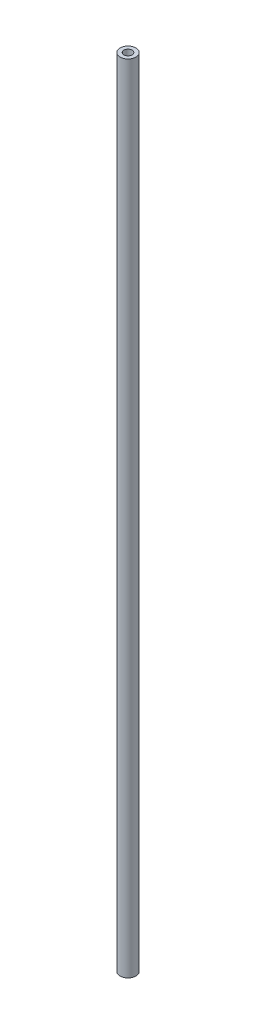
ISO-10303-21;
HEADER;
FILE_DESCRIPTION(('STEP AP214'),'2;1');
FILE_NAME('part.step','',(''),(''),'','','');
FILE_SCHEMA(('AUTOMOTIVE_DESIGN { 1 0 10303 214 1 1 1 1 }'));
ENDSEC;
DATA;
#1=APPLICATION_CONTEXT('core data for automotive mechanical design processes');
#2=APPLICATION_PROTOCOL_DEFINITION('international standard','automotive_design',2000,#1);
#3=PRODUCT_CONTEXT('',#1,'mechanical');
#4=PRODUCT('Part','Part','',(#3));
#5=PRODUCT_RELATED_PRODUCT_CATEGORY('part','',(#4));
#6=PRODUCT_DEFINITION_FORMATION('','',#4);
#7=PRODUCT_DEFINITION_CONTEXT('part definition',#1,'design');
#8=PRODUCT_DEFINITION('design','',#6,#7);
#9=PRODUCT_DEFINITION_SHAPE('','',#8);
#10=(LENGTH_UNIT() NAMED_UNIT(*) SI_UNIT(.MILLI.,.METRE.));
#11=(NAMED_UNIT(*) PLANE_ANGLE_UNIT() SI_UNIT($,.RADIAN.));
#12=(NAMED_UNIT(*) SI_UNIT($,.STERADIAN.) SOLID_ANGLE_UNIT());
#13=UNCERTAINTY_MEASURE_WITH_UNIT(LENGTH_MEASURE(1.E-05),#10,'distance_accuracy_value','');
#14=(GEOMETRIC_REPRESENTATION_CONTEXT(3) GLOBAL_UNCERTAINTY_ASSIGNED_CONTEXT((#13)) GLOBAL_UNIT_ASSIGNED_CONTEXT((#10,
#11,#12)) REPRESENTATION_CONTEXT('',''));
#15=CARTESIAN_POINT('',(0.,0.,0.));
#16=DIRECTION('',(0.,0.,1.));
#17=DIRECTION('',(1.,0.,0.));
#18=AXIS2_PLACEMENT_3D('',#15,#16,#17);
#19=CARTESIAN_POINT('',(0.,500.,0.));
#20=DIRECTION('',(0.,-1.,0.));
#21=DIRECTION('',(0.,0.,-1.));
#22=AXIS2_PLACEMENT_3D('',#19,#20,#21);
#23=CYLINDRICAL_SURFACE('',#22,5.);
#24=CARTESIAN_POINT('',(0.,500.,0.));
#25=DIRECTION('',(0.,1.,0.));
#26=DIRECTION('',(0.,0.,1.));
#27=AXIS2_PLACEMENT_3D('',#24,#25,#26);
#28=CIRCLE('',#27,5.);
#29=CARTESIAN_POINT('',(0.,500.,5.));
#30=VERTEX_POINT('',#29);
#31=EDGE_CURVE('E10',#30,#30,#28,.T.);
#32=ORIENTED_EDGE('',*,*,#31,.F.);
#33=EDGE_LOOP('',(#32));
#34=FACE_BOUND('',#33,.T.);
#35=CARTESIAN_POINT('',(0.,0.,0.));
#36=DIRECTION('',(0.,1.,0.));
#37=DIRECTION('',(0.,0.,1.));
#38=AXIS2_PLACEMENT_3D('',#35,#36,#37);
#39=CIRCLE('',#38,5.);
#40=CARTESIAN_POINT('',(0.,0.,5.));
#41=VERTEX_POINT('',#40);
#42=EDGE_CURVE('E37',#41,#41,#39,.T.);
#43=ORIENTED_EDGE('',*,*,#42,.T.);
#44=EDGE_LOOP('',(#43));
#45=FACE_BOUND('',#44,.T.);
#46=ADVANCED_FACE('F34',(#34,#45),#23,.T.);
#47=CARTESIAN_POINT('',(0.,500.,0.));
#48=DIRECTION('',(0.,1.,0.));
#49=DIRECTION('',(0.,0.,1.));
#50=AXIS2_PLACEMENT_3D('',#47,#48,#49);
#51=PLANE('',#50);
#52=CARTESIAN_POINT('',(0.,500.,0.));
#53=DIRECTION('',(0.,1.,0.));
#54=DIRECTION('',(0.,0.,1.));
#55=AXIS2_PLACEMENT_3D('',#52,#53,#54);
#56=CIRCLE('',#55,2.6);
#57=CARTESIAN_POINT('',(0.,500.,2.6));
#58=VERTEX_POINT('',#57);
#59=EDGE_CURVE('E52',#58,#58,#56,.T.);
#60=ORIENTED_EDGE('',*,*,#59,.F.);
#61=EDGE_LOOP('',(#60));
#62=FACE_BOUND('',#61,.T.);
#63=ORIENTED_EDGE('',*,*,#31,.T.);
#64=EDGE_LOOP('',(#63));
#65=FACE_BOUND('',#64,.T.);
#66=ADVANCED_FACE('F67',(#62,#65),#51,.T.);
#67=CARTESIAN_POINT('',(0.,0.,0.));
#68=DIRECTION('',(0.,1.,0.));
#69=DIRECTION('',(0.,0.,1.));
#70=AXIS2_PLACEMENT_3D('',#67,#68,#69);
#71=PLANE('',#70);
#72=CARTESIAN_POINT('',(0.,0.,0.));
#73=DIRECTION('',(0.,-1.,0.));
#74=DIRECTION('',(0.,0.,-1.));
#75=AXIS2_PLACEMENT_3D('',#72,#73,#74);
#76=CIRCLE('',#75,2.6);
#77=CARTESIAN_POINT('',(0.,0.,-2.6));
#78=VERTEX_POINT('',#77);
#79=EDGE_CURVE('E46',#78,#78,#76,.T.);
#80=ORIENTED_EDGE('',*,*,#79,.F.);
#81=EDGE_LOOP('',(#80));
#82=FACE_BOUND('',#81,.T.);
#83=ORIENTED_EDGE('',*,*,#42,.F.);
#84=EDGE_LOOP('',(#83));
#85=FACE_BOUND('',#84,.T.);
#86=ADVANCED_FACE('F69',(#82,#85),#71,.F.);
#87=CARTESIAN_POINT('',(0.,10.,0.));
#88=DIRECTION('',(0.,-1.,0.));
#89=DIRECTION('',(0.,0.,-1.));
#90=AXIS2_PLACEMENT_3D('',#87,#88,#89);
#91=CYLINDRICAL_SURFACE('',#90,2.6);
#92=CARTESIAN_POINT('',(0.,10.,0.));
#93=DIRECTION('',(0.,-1.,0.));
#94=DIRECTION('',(0.,0.,-1.));
#95=AXIS2_PLACEMENT_3D('',#92,#93,#94);
#96=CIRCLE('',#95,2.6);
#97=CARTESIAN_POINT('',(0.,10.,-2.6));
#98=VERTEX_POINT('',#97);
#99=EDGE_CURVE('E44',#98,#98,#96,.T.);
#100=ORIENTED_EDGE('',*,*,#99,.F.);
#101=EDGE_LOOP('',(#100));
#102=FACE_BOUND('',#101,.T.);
#103=ORIENTED_EDGE('',*,*,#79,.T.);
#104=EDGE_LOOP('',(#103));
#105=FACE_BOUND('',#104,.T.);
#106=ADVANCED_FACE('F75',(#102,#105),#91,.F.);
#107=CARTESIAN_POINT('',(0.,10.,0.));
#108=DIRECTION('',(0.,-1.,0.));
#109=DIRECTION('',(0.,0.,-1.));
#110=AXIS2_PLACEMENT_3D('',#107,#108,#109);
#111=PLANE('',#110);
#112=ORIENTED_EDGE('',*,*,#99,.T.);
#113=EDGE_LOOP('',(#112));
#114=FACE_BOUND('',#113,.T.);
#115=ADVANCED_FACE('F63',(#114),#111,.T.);
#116=CARTESIAN_POINT('',(0.,490.,0.));
#117=DIRECTION('',(0.,1.,0.));
#118=DIRECTION('',(0.,0.,1.));
#119=AXIS2_PLACEMENT_3D('',#116,#117,#118);
#120=CYLINDRICAL_SURFACE('',#119,2.6);
#121=CARTESIAN_POINT('',(0.,490.,0.));
#122=DIRECTION('',(0.,1.,0.));
#123=DIRECTION('',(0.,0.,1.));
#124=AXIS2_PLACEMENT_3D('',#121,#122,#123);
#125=CIRCLE('',#124,2.6);
#126=CARTESIAN_POINT('',(0.,490.,2.6));
#127=VERTEX_POINT('',#126);
#128=EDGE_CURVE('E49',#127,#127,#125,.T.);
#129=ORIENTED_EDGE('',*,*,#128,.F.);
#130=EDGE_LOOP('',(#129));
#131=FACE_BOUND('',#130,.T.);
#132=ORIENTED_EDGE('',*,*,#59,.T.);
#133=EDGE_LOOP('',(#132));
#134=FACE_BOUND('',#133,.T.);
#135=ADVANCED_FACE('F60',(#131,#134),#120,.F.);
#136=CARTESIAN_POINT('',(0.,490.,0.));
#137=DIRECTION('',(0.,1.,0.));
#138=DIRECTION('',(0.,0.,1.));
#139=AXIS2_PLACEMENT_3D('',#136,#137,#138);
#140=PLANE('',#139);
#141=ORIENTED_EDGE('',*,*,#128,.T.);
#142=EDGE_LOOP('',(#141));
#143=FACE_BOUND('',#142,.T.);
#144=ADVANCED_FACE('F58',(#143),#140,.T.);
#145=CLOSED_SHELL('',(#46,#66,#86,#106,#115,#135,#144));
#146=MANIFOLD_SOLID_BREP('B2',#145);
#147=ADVANCED_BREP_SHAPE_REPRESENTATION('',(#18,#146),#14);
#148=SHAPE_DEFINITION_REPRESENTATION(#9,#147);
ENDSEC;
END-ISO-10303-21;
